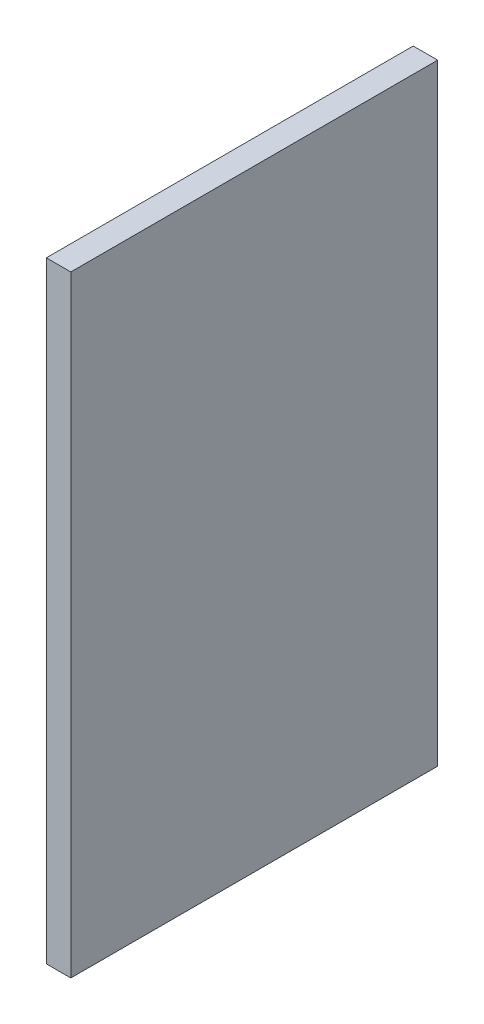
ISO-10303-21;
HEADER;
FILE_DESCRIPTION(('STEP AP214'),'2;1');
FILE_NAME('part.step','',(''),(''),'','','');
FILE_SCHEMA(('AUTOMOTIVE_DESIGN { 1 0 10303 214 1 1 1 1 }'));
ENDSEC;
DATA;
#1=APPLICATION_CONTEXT('core data for automotive mechanical design processes');
#2=APPLICATION_PROTOCOL_DEFINITION('international standard','automotive_design',2000,#1);
#3=PRODUCT_CONTEXT('',#1,'mechanical');
#4=PRODUCT('Part','Part','',(#3));
#5=PRODUCT_RELATED_PRODUCT_CATEGORY('part','',(#4));
#6=PRODUCT_DEFINITION_FORMATION('','',#4);
#7=PRODUCT_DEFINITION_CONTEXT('part definition',#1,'design');
#8=PRODUCT_DEFINITION('design','',#6,#7);
#9=PRODUCT_DEFINITION_SHAPE('','',#8);
#10=(LENGTH_UNIT() NAMED_UNIT(*) SI_UNIT(.MILLI.,.METRE.));
#11=(NAMED_UNIT(*) PLANE_ANGLE_UNIT() SI_UNIT($,.RADIAN.));
#12=(NAMED_UNIT(*) SI_UNIT($,.STERADIAN.) SOLID_ANGLE_UNIT());
#13=UNCERTAINTY_MEASURE_WITH_UNIT(LENGTH_MEASURE(1.E-05),#10,'distance_accuracy_value','');
#14=(GEOMETRIC_REPRESENTATION_CONTEXT(3) GLOBAL_UNCERTAINTY_ASSIGNED_CONTEXT((#13)) GLOBAL_UNIT_ASSIGNED_CONTEXT((#10,
#11,#12)) REPRESENTATION_CONTEXT('',''));
#15=CARTESIAN_POINT('',(0.,0.,0.));
#16=DIRECTION('',(0.,0.,1.));
#17=DIRECTION('',(1.,0.,0.));
#18=AXIS2_PLACEMENT_3D('',#15,#16,#17);
#19=CARTESIAN_POINT('',(-110.8,-10.,38.));
#20=DIRECTION('',(-1.,0.,0.));
#21=DIRECTION('',(0.,0.,1.));
#22=AXIS2_PLACEMENT_3D('',#19,#20,#21);
#23=PLANE('',#22);
#24=DIRECTION('',(0.,1.,0.));
#25=VECTOR('',#24,1.);
#26=CARTESIAN_POINT('',(-110.8,-10.,38.));
#27=LINE('',#26,#25);
#28=CARTESIAN_POINT('',(-110.8,-10.,38.));
#29=VERTEX_POINT('',#28);
#30=CARTESIAN_POINT('',(-110.8,10.,38.));
#31=VERTEX_POINT('',#30);
#32=EDGE_CURVE('E44',#29,#31,#27,.T.);
#33=ORIENTED_EDGE('',*,*,#32,.T.);
#34=DIRECTION('',(0.,0.,1.));
#35=VECTOR('',#34,1.);
#36=CARTESIAN_POINT('',(-110.8,10.,38.));
#37=LINE('',#36,#35);
#38=CARTESIAN_POINT('',(-110.8,10.,26.));
#39=VERTEX_POINT('',#38);
#40=EDGE_CURVE('E81',#39,#31,#37,.T.);
#41=ORIENTED_EDGE('',*,*,#40,.F.);
#42=DIRECTION('',(0.,1.,0.));
#43=VECTOR('',#42,1.);
#44=CARTESIAN_POINT('',(-110.8,-10.,26.));
#45=LINE('',#44,#43);
#46=CARTESIAN_POINT('',(-110.8,-10.,26.));
#47=VERTEX_POINT('',#46);
#48=EDGE_CURVE('E11',#47,#39,#45,.T.);
#49=ORIENTED_EDGE('',*,*,#48,.F.);
#50=DIRECTION('',(0.,0.,1.));
#51=VECTOR('',#50,1.);
#52=CARTESIAN_POINT('',(-110.8,-10.,38.));
#53=LINE('',#52,#51);
#54=EDGE_CURVE('E82',#47,#29,#53,.T.);
#55=ORIENTED_EDGE('',*,*,#54,.T.);
#56=EDGE_LOOP('',(#33,#41,#49,#55));
#57=FACE_BOUND('',#56,.T.);
#58=ADVANCED_FACE('F41',(#57),#23,.T.);
#59=CARTESIAN_POINT('',(-110.8,-10.,26.));
#60=DIRECTION('',(0.,0.,-1.));
#61=DIRECTION('',(-1.,0.,0.));
#62=AXIS2_PLACEMENT_3D('',#59,#60,#61);
#63=PLANE('',#62);
#64=ORIENTED_EDGE('',*,*,#48,.T.);
#65=DIRECTION('',(-1.,0.,0.));
#66=VECTOR('',#65,1.);
#67=CARTESIAN_POINT('',(-110.8,10.,26.));
#68=LINE('',#67,#66);
#69=CARTESIAN_POINT('',(-110.,10.,26.));
#70=VERTEX_POINT('',#69);
#71=EDGE_CURVE('E98',#70,#39,#68,.T.);
#72=ORIENTED_EDGE('',*,*,#71,.F.);
#73=DIRECTION('',(0.,1.,0.));
#74=VECTOR('',#73,1.);
#75=CARTESIAN_POINT('',(-110.,-10.,26.));
#76=LINE('',#75,#74);
#77=CARTESIAN_POINT('',(-110.,-10.,26.));
#78=VERTEX_POINT('',#77);
#79=EDGE_CURVE('E49',#78,#70,#76,.T.);
#80=ORIENTED_EDGE('',*,*,#79,.F.);
#81=DIRECTION('',(-1.,0.,0.));
#82=VECTOR('',#81,1.);
#83=CARTESIAN_POINT('',(-110.8,-10.,26.));
#84=LINE('',#83,#82);
#85=EDGE_CURVE('E87',#78,#47,#84,.T.);
#86=ORIENTED_EDGE('',*,*,#85,.T.);
#87=EDGE_LOOP('',(#64,#72,#80,#86));
#88=FACE_BOUND('',#87,.T.);
#89=ADVANCED_FACE('F113',(#88),#63,.T.);
#90=CARTESIAN_POINT('',(-110.,-10.,38.));
#91=DIRECTION('',(1.,0.,0.));
#92=DIRECTION('',(0.,0.,-1.));
#93=AXIS2_PLACEMENT_3D('',#90,#91,#92);
#94=PLANE('',#93);
#95=ORIENTED_EDGE('',*,*,#79,.T.);
#96=DIRECTION('',(0.,0.,-1.));
#97=VECTOR('',#96,1.);
#98=CARTESIAN_POINT('',(-110.,10.,38.));
#99=LINE('',#98,#97);
#100=CARTESIAN_POINT('',(-110.,10.,38.));
#101=VERTEX_POINT('',#100);
#102=EDGE_CURVE('E94',#101,#70,#99,.T.);
#103=ORIENTED_EDGE('',*,*,#102,.F.);
#104=DIRECTION('',(0.,1.,0.));
#105=VECTOR('',#104,1.);
#106=CARTESIAN_POINT('',(-110.,-10.,38.));
#107=LINE('',#106,#105);
#108=CARTESIAN_POINT('',(-110.,-10.,38.));
#109=VERTEX_POINT('',#108);
#110=EDGE_CURVE('E86',#109,#101,#107,.T.);
#111=ORIENTED_EDGE('',*,*,#110,.F.);
#112=DIRECTION('',(0.,0.,-1.));
#113=VECTOR('',#112,1.);
#114=CARTESIAN_POINT('',(-110.,-10.,38.));
#115=LINE('',#114,#113);
#116=EDGE_CURVE('E106',#109,#78,#115,.T.);
#117=ORIENTED_EDGE('',*,*,#116,.T.);
#118=EDGE_LOOP('',(#95,#103,#111,#117));
#119=FACE_BOUND('',#118,.T.);
#120=ADVANCED_FACE('F110',(#119),#94,.T.);
#121=CARTESIAN_POINT('',(-110.8,-10.,38.));
#122=DIRECTION('',(0.,0.,1.));
#123=DIRECTION('',(1.,0.,0.));
#124=AXIS2_PLACEMENT_3D('',#121,#122,#123);
#125=PLANE('',#124);
#126=ORIENTED_EDGE('',*,*,#110,.T.);
#127=DIRECTION('',(1.,0.,0.));
#128=VECTOR('',#127,1.);
#129=CARTESIAN_POINT('',(-110.8,10.,38.));
#130=LINE('',#129,#128);
#131=EDGE_CURVE('E89',#31,#101,#130,.T.);
#132=ORIENTED_EDGE('',*,*,#131,.F.);
#133=ORIENTED_EDGE('',*,*,#32,.F.);
#134=DIRECTION('',(1.,0.,0.));
#135=VECTOR('',#134,1.);
#136=CARTESIAN_POINT('',(-110.8,-10.,38.));
#137=LINE('',#136,#135);
#138=EDGE_CURVE('E104',#29,#109,#137,.T.);
#139=ORIENTED_EDGE('',*,*,#138,.T.);
#140=EDGE_LOOP('',(#126,#132,#133,#139));
#141=FACE_BOUND('',#140,.T.);
#142=ADVANCED_FACE('F90',(#141),#125,.T.);
#143=CARTESIAN_POINT('',(0.,-10.,0.));
#144=DIRECTION('',(0.,-1.,0.));
#145=DIRECTION('',(0.,0.,-1.));
#146=AXIS2_PLACEMENT_3D('',#143,#144,#145);
#147=PLANE('',#146);
#148=ORIENTED_EDGE('',*,*,#54,.F.);
#149=ORIENTED_EDGE('',*,*,#85,.F.);
#150=ORIENTED_EDGE('',*,*,#116,.F.);
#151=ORIENTED_EDGE('',*,*,#138,.F.);
#152=EDGE_LOOP('',(#148,#149,#150,#151));
#153=FACE_BOUND('',#152,.T.);
#154=ADVANCED_FACE('F115',(#153),#147,.T.);
#155=CARTESIAN_POINT('',(0.,10.,0.));
#156=DIRECTION('',(0.,-1.,0.));
#157=DIRECTION('',(0.,0.,-1.));
#158=AXIS2_PLACEMENT_3D('',#155,#156,#157);
#159=PLANE('',#158);
#160=ORIENTED_EDGE('',*,*,#40,.T.);
#161=ORIENTED_EDGE('',*,*,#131,.T.);
#162=ORIENTED_EDGE('',*,*,#102,.T.);
#163=ORIENTED_EDGE('',*,*,#71,.T.);
#164=EDGE_LOOP('',(#160,#161,#162,#163));
#165=FACE_BOUND('',#164,.T.);
#166=ADVANCED_FACE('F97',(#165),#159,.F.);
#167=CLOSED_SHELL('',(#58,#89,#120,#142,#154,#166));
#168=MANIFOLD_SOLID_BREP('B2',#167);
#169=ADVANCED_BREP_SHAPE_REPRESENTATION('',(#18,#168),#14);
#170=SHAPE_DEFINITION_REPRESENTATION(#9,#169);
ENDSEC;
END-ISO-10303-21;
